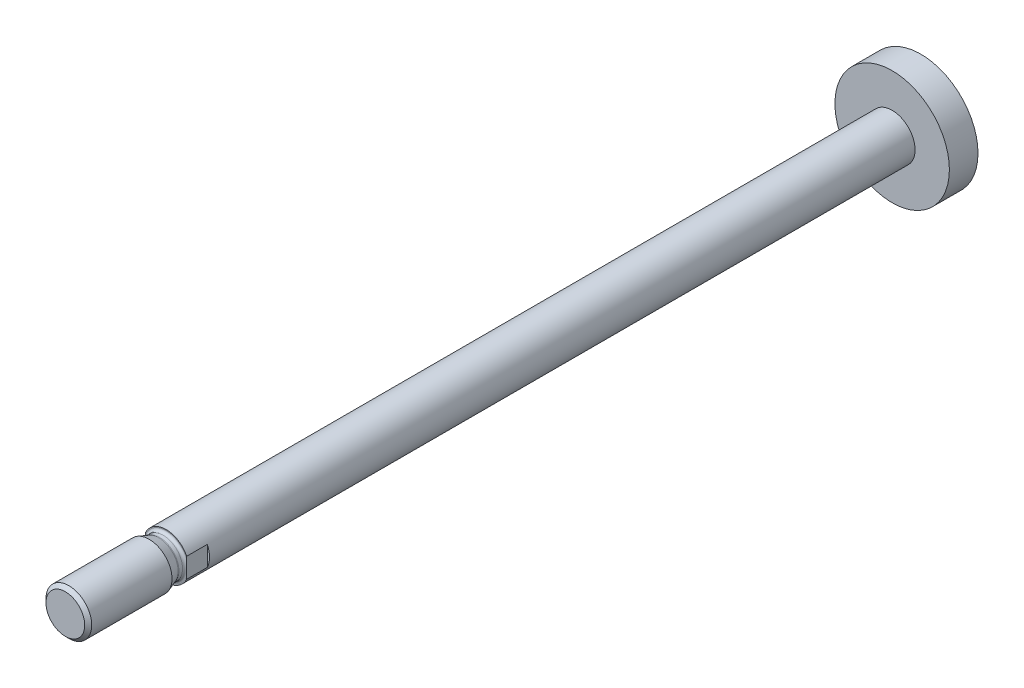
ISO-10303-21;
HEADER;
FILE_DESCRIPTION(('STEP AP214'),'2;1');
FILE_NAME('part.step','',(''),(''),'','','');
FILE_SCHEMA(('AUTOMOTIVE_DESIGN { 1 0 10303 214 1 1 1 1 }'));
ENDSEC;
DATA;
#1=APPLICATION_CONTEXT('core data for automotive mechanical design processes');
#2=APPLICATION_PROTOCOL_DEFINITION('international standard','automotive_design',2000,#1);
#3=PRODUCT_CONTEXT('',#1,'mechanical');
#4=PRODUCT('Part','Part','',(#3));
#5=PRODUCT_RELATED_PRODUCT_CATEGORY('part','',(#4));
#6=PRODUCT_DEFINITION_FORMATION('','',#4);
#7=PRODUCT_DEFINITION_CONTEXT('part definition',#1,'design');
#8=PRODUCT_DEFINITION('design','',#6,#7);
#9=PRODUCT_DEFINITION_SHAPE('','',#8);
#10=(LENGTH_UNIT() NAMED_UNIT(*) SI_UNIT(.MILLI.,.METRE.));
#11=(NAMED_UNIT(*) PLANE_ANGLE_UNIT() SI_UNIT($,.RADIAN.));
#12=(NAMED_UNIT(*) SI_UNIT($,.STERADIAN.) SOLID_ANGLE_UNIT());
#13=UNCERTAINTY_MEASURE_WITH_UNIT(LENGTH_MEASURE(1.E-05),#10,'distance_accuracy_value','');
#14=(GEOMETRIC_REPRESENTATION_CONTEXT(3) GLOBAL_UNCERTAINTY_ASSIGNED_CONTEXT((#13)) GLOBAL_UNIT_ASSIGNED_CONTEXT((#10,
#11,#12)) REPRESENTATION_CONTEXT('',''));
#15=CARTESIAN_POINT('',(0.,0.,0.));
#16=DIRECTION('',(0.,0.,1.));
#17=DIRECTION('',(1.,0.,0.));
#18=AXIS2_PLACEMENT_3D('',#15,#16,#17);
#19=CARTESIAN_POINT('',(0.,0.,6.));
#20=DIRECTION('',(0.,0.,-1.));
#21=DIRECTION('',(-1.,0.,0.));
#22=AXIS2_PLACEMENT_3D('',#19,#20,#21);
#23=PLANE('',#22);
#24=DIRECTION('',(0.,1.,0.));
#25=VECTOR('',#24,1.);
#26=CARTESIAN_POINT('',(-4.5,0.,6.));
#27=LINE('',#26,#25);
#28=CARTESIAN_POINT('',(-4.5,-2.17944947177034,6.00000000000001));
#29=VERTEX_POINT('',#28);
#30=CARTESIAN_POINT('',(-4.5,-1.67032930884929,6.));
#31=VERTEX_POINT('',#30);
#32=EDGE_CURVE('E52',#29,#31,#27,.T.);
#33=ORIENTED_EDGE('',*,*,#32,.F.);
#34=CARTESIAN_POINT('',(0.,0.,6.00000000000001));
#35=DIRECTION('',(0.,0.,1.));
#36=DIRECTION('',(1.,0.,0.));
#37=AXIS2_PLACEMENT_3D('',#34,#35,#36);
#38=CIRCLE('',#37,5.);
#39=CARTESIAN_POINT('',(4.5,-2.17944947177034,6.00000000000001));
#40=VERTEX_POINT('',#39);
#41=EDGE_CURVE('E145',#29,#40,#38,.T.);
#42=ORIENTED_EDGE('',*,*,#41,.T.);
#43=DIRECTION('',(0.,-1.,0.));
#44=VECTOR('',#43,1.);
#45=CARTESIAN_POINT('',(4.5,0.,6.));
#46=LINE('',#45,#44);
#47=CARTESIAN_POINT('',(4.5,-1.67032930884926,5.99999999999964));
#48=VERTEX_POINT('',#47);
#49=EDGE_CURVE('E99',#48,#40,#46,.T.);
#50=ORIENTED_EDGE('',*,*,#49,.F.);
#51=CARTESIAN_POINT('',(0.,0.,6.));
#52=DIRECTION('',(0.,0.,1.));
#53=DIRECTION('',(1.,0.,0.));
#54=AXIS2_PLACEMENT_3D('',#51,#52,#53);
#55=CIRCLE('',#54,4.8000000000001);
#56=EDGE_CURVE('E147',#31,#48,#55,.T.);
#57=ORIENTED_EDGE('',*,*,#56,.F.);
#58=EDGE_LOOP('',(#33,#42,#50,#57));
#59=FACE_BOUND('',#58,.T.);
#60=ADVANCED_FACE('F38',(#59),#23,.F.);
#61=CARTESIAN_POINT('',(-4.5,1.67032930884926,5.99999999999964));
#62=VERTEX_POINT('',#61);
#63=CARTESIAN_POINT('',(-4.5,2.17944947177034,6.00000000000001));
#64=VERTEX_POINT('',#63);
#65=EDGE_CURVE('E108',#62,#64,#27,.T.);
#66=ORIENTED_EDGE('',*,*,#65,.F.);
#67=CARTESIAN_POINT('',(4.5,1.67032930884929,6.));
#68=VERTEX_POINT('',#67);
#69=EDGE_CURVE('E148',#68,#62,#55,.T.);
#70=ORIENTED_EDGE('',*,*,#69,.F.);
#71=CARTESIAN_POINT('',(4.5,2.17944947177034,6.00000000000001));
#72=VERTEX_POINT('',#71);
#73=EDGE_CURVE('E60',#72,#68,#46,.T.);
#74=ORIENTED_EDGE('',*,*,#73,.F.);
#75=EDGE_CURVE('E107',#72,#64,#38,.T.);
#76=ORIENTED_EDGE('',*,*,#75,.T.);
#77=EDGE_LOOP('',(#66,#70,#74,#76));
#78=FACE_BOUND('',#77,.T.);
#79=ADVANCED_FACE('F204',(#78),#23,.F.);
#80=CARTESIAN_POINT('',(0.,0.,-158.85));
#81=DIRECTION('',(0.,0.,1.));
#82=DIRECTION('',(1.,0.,0.));
#83=AXIS2_PLACEMENT_3D('',#80,#81,#82);
#84=CYLINDRICAL_SURFACE('',#83,5.);
#85=CARTESIAN_POINT('',(0.,0.,-152.6));
#86=DIRECTION('',(0.,0.,1.));
#87=DIRECTION('',(1.,0.,0.));
#88=AXIS2_PLACEMENT_3D('',#85,#86,#87);
#89=CIRCLE('',#88,5.);
#90=CARTESIAN_POINT('',(5.,0.,-152.6));
#91=VERTEX_POINT('',#90);
#92=EDGE_CURVE('E142',#91,#91,#89,.T.);
#93=ORIENTED_EDGE('',*,*,#92,.T.);
#94=EDGE_LOOP('',(#93));
#95=FACE_BOUND('',#94,.T.);
#96=DIRECTION('',(0.,0.,1.));
#97=VECTOR('',#96,1.);
#98=CARTESIAN_POINT('',(-4.5,-2.17944947177034,-158.85));
#99=LINE('',#98,#97);
#100=CARTESIAN_POINT('',(-4.5,-2.17944947177034,1.5));
#101=VERTEX_POINT('',#100);
#102=EDGE_CURVE('E116',#101,#29,#99,.T.);
#103=ORIENTED_EDGE('',*,*,#102,.F.);
#104=CARTESIAN_POINT('',(0.,0.,1.5));
#105=DIRECTION('',(0.,0.,1.));
#106=DIRECTION('',(1.,0.,0.));
#107=AXIS2_PLACEMENT_3D('',#104,#105,#106);
#108=CIRCLE('',#107,5.);
#109=CARTESIAN_POINT('',(-4.5,2.17944947177034,1.5));
#110=VERTEX_POINT('',#109);
#111=EDGE_CURVE('E11',#110,#101,#108,.T.);
#112=ORIENTED_EDGE('',*,*,#111,.F.);
#113=DIRECTION('',(0.,0.,1.));
#114=VECTOR('',#113,1.);
#115=CARTESIAN_POINT('',(-4.5,2.17944947177034,-158.85));
#116=LINE('',#115,#114);
#117=EDGE_CURVE('E114',#64,#110,#116,.F.);
#118=ORIENTED_EDGE('',*,*,#117,.F.);
#119=ORIENTED_EDGE('',*,*,#75,.F.);
#120=DIRECTION('',(0.,0.,1.));
#121=VECTOR('',#120,1.);
#122=CARTESIAN_POINT('',(4.5,2.17944947177034,-158.85));
#123=LINE('',#122,#121);
#124=CARTESIAN_POINT('',(4.5,2.17944947177034,1.5));
#125=VERTEX_POINT('',#124);
#126=EDGE_CURVE('E97',#125,#72,#123,.T.);
#127=ORIENTED_EDGE('',*,*,#126,.F.);
#128=CARTESIAN_POINT('',(4.5,-2.17944947177034,1.5));
#129=VERTEX_POINT('',#128);
#130=EDGE_CURVE('E41',#129,#125,#108,.T.);
#131=ORIENTED_EDGE('',*,*,#130,.F.);
#132=DIRECTION('',(0.,0.,1.));
#133=VECTOR('',#132,1.);
#134=CARTESIAN_POINT('',(4.5,-2.17944947177034,-158.85));
#135=LINE('',#134,#133);
#136=EDGE_CURVE('E98',#40,#129,#135,.F.);
#137=ORIENTED_EDGE('',*,*,#136,.F.);
#138=ORIENTED_EDGE('',*,*,#41,.F.);
#139=EDGE_LOOP('',(#103,#112,#118,#119,#127,#131,#137,#138));
#140=FACE_BOUND('',#139,.T.);
#141=ADVANCED_FACE('F104',(#95,#140),#84,.T.);
#142=CARTESIAN_POINT('',(0.,0.,6.6000000000001));
#143=DIRECTION('',(0.,0.,1.));
#144=DIRECTION('',(1.,0.,0.));
#145=AXIS2_PLACEMENT_3D('',#142,#143,#144);
#146=TOROIDAL_SURFACE('',#145,4.8000000000001,0.600000000000097);
#147=CARTESIAN_POINT('',(0.,0.,6.6));
#148=DIRECTION('',(0.,0.,1.));
#149=DIRECTION('',(1.,0.,0.));
#150=AXIS2_PLACEMENT_3D('',#147,#148,#149);
#151=CIRCLE('',#150,4.2);
#152=CARTESIAN_POINT('',(4.2,0.,6.6));
#153=VERTEX_POINT('',#152);
#154=EDGE_CURVE('E133',#153,#153,#151,.T.);
#155=ORIENTED_EDGE('',*,*,#154,.F.);
#156=EDGE_LOOP('',(#155));
#157=FACE_BOUND('',#156,.T.);
#158=CARTESIAN_POINT('',(-4.5,0.,6.08038475772938));
#159=CARTESIAN_POINT('',(-4.5,0.0998067376764843,6.08037873066074));
#160=CARTESIAN_POINT('',(-4.5,0.199616272799417,6.07841991767971));
#161=CARTESIAN_POINT('',(-4.5,0.399124218962602,6.07111486101505));
#162=CARTESIAN_POINT('',(-4.5,0.498822593852194,6.0657677261318));
#163=CARTESIAN_POINT('',(-4.5,0.698741622507767,6.05307617315213));
#164=CARTESIAN_POINT('',(-4.5,0.798961381101574,6.0457188074819));
#165=CARTESIAN_POINT('',(-4.5,0.999428388252497,6.03096110271823));
#166=CARTESIAN_POINT('',(-4.5,1.09967563538733,6.0235607506722));
#167=CARTESIAN_POINT('',(-4.5,1.3016110629467,6.01081416538467));
#168=CARTESIAN_POINT('',(-4.5,1.40330123417861,6.00549549428931));
#169=CARTESIAN_POINT('',(-4.5,1.60677834274211,5.99955448543189));
#170=CARTESIAN_POINT('',(-4.5,1.70856516640856,5.99892893983888));
#171=CARTESIAN_POINT('',(-4.5,1.91089156421157,6.00529022688693));
#172=CARTESIAN_POINT('',(-4.5,2.01143241584337,6.01219244591137));
#173=CARTESIAN_POINT('',(-4.5,2.16105475707008,6.03106064313289));
#174=CARTESIAN_POINT('',(-4.5,2.21066681684127,6.03875363847474));
#175=CARTESIAN_POINT('',(-4.5,2.30920875497539,6.05763368849147));
#176=CARTESIAN_POINT('',(-4.5,2.35813908405672,6.06881830784301));
#177=CARTESIAN_POINT('',(-4.5,2.45129258214881,6.09452632536258));
#178=CARTESIAN_POINT('',(-4.5,2.49559809321058,6.10874531075254));
#179=CARTESIAN_POINT('',(-4.5,2.58269752158666,6.14182358984602));
#180=CARTESIAN_POINT('',(-4.5,2.62548470760037,6.16070115913153));
#181=CARTESIAN_POINT('',(-4.5,2.708771704774,6.20450151168286));
#182=CARTESIAN_POINT('',(-4.5,2.7492254368668,6.22951398112986));
#183=CARTESIAN_POINT('',(-4.5,2.8245886025167,6.28679682914211));
#184=CARTESIAN_POINT('',(-4.5,2.85953391357846,6.31901662605556));
#185=CARTESIAN_POINT('',(-4.5,2.90361083640121,6.37234972904509));
#186=CARTESIAN_POINT('',(-4.5,2.91659554231069,6.39027429027149));
#187=CARTESIAN_POINT('',(-4.5,2.93974058832693,6.42788720022357));
#188=CARTESIAN_POINT('',(-4.5,2.94990211335329,6.44757480437922));
#189=CARTESIAN_POINT('',(-4.5,2.96675958241278,6.48864437298186));
#190=CARTESIAN_POINT('',(-4.5,2.97341943638567,6.51004146018642));
#191=CARTESIAN_POINT('',(-4.5,2.98245791270468,6.55372202128066));
#192=CARTESIAN_POINT('',(-4.5,2.98484130218967,6.57600447984377));
#193=CARTESIAN_POINT('',(-4.5,2.98506053282126,6.61790531869471));
#194=CARTESIAN_POINT('',(-4.5,2.98340761486304,6.63752261821441));
#195=CARTESIAN_POINT('',(-4.5,2.97674509421289,6.67617607456343));
#196=CARTESIAN_POINT('',(-4.5,2.97173449743984,6.6952120575414));
#197=CARTESIAN_POINT('',(-4.5,2.95888564781516,6.73184320253794));
#198=CARTESIAN_POINT('',(-4.5,2.95110802141781,6.74946002141396));
#199=CARTESIAN_POINT('',(-4.5,2.93318626166465,6.7834289561956));
#200=CARTESIAN_POINT('',(-4.5,2.9230415253375,6.79978074844682));
#201=CARTESIAN_POINT('',(-4.5,2.89384468501091,6.84100748772974));
#202=CARTESIAN_POINT('',(-4.5,2.87320788143216,6.86476044928355));
#203=CARTESIAN_POINT('',(-4.5,2.82847619421112,6.90876991000349));
#204=CARTESIAN_POINT('',(-4.5,2.80437017771157,6.92901467162748));
#205=CARTESIAN_POINT('',(-4.5,2.73725469332988,6.9786229862522));
#206=CARTESIAN_POINT('',(-4.5,2.69223076475127,7.00523927036113));
#207=CARTESIAN_POINT('',(-4.5,2.59889783314091,7.05161749488126));
#208=CARTESIAN_POINT('',(-4.5,2.55058470947157,7.07137064103301));
#209=CARTESIAN_POINT('',(-4.5,2.45254575507272,7.10534880858189));
#210=CARTESIAN_POINT('',(-4.5,2.40283511990763,7.11961868503931));
#211=CARTESIAN_POINT('',(-4.5,2.30236556499697,7.14394174846778));
#212=CARTESIAN_POINT('',(-4.5,2.25160550461614,7.15399006350479));
#213=CARTESIAN_POINT('',(-4.5,2.14932910845115,7.17070819486747));
#214=CARTESIAN_POINT('',(-4.5,2.097810491898,7.17736364613804));
#215=CARTESIAN_POINT('',(-4.5,1.99454893701165,7.18787736691893));
#216=CARTESIAN_POINT('',(-4.5,1.94280625316185,7.19173824340202));
#217=CARTESIAN_POINT('',(-4.5,1.76963465418981,7.20091417499184));
#218=CARTESIAN_POINT('',(-4.5,1.64795335250754,7.20121716445481));
#219=CARTESIAN_POINT('',(-4.5,1.40473993568908,7.19490670898454));
#220=CARTESIAN_POINT('',(-4.5,1.28320824117427,7.18828396320795));
#221=CARTESIAN_POINT('',(-4.5,1.04004923255828,7.17231563103041));
#222=CARTESIAN_POINT('',(-4.5,0.918422381035732,7.16296359204275));
#223=CARTESIAN_POINT('',(-4.5,0.675162216086409,7.14536648513597));
#224=CARTESIAN_POINT('',(-4.5,0.553528961243309,7.13712068197018));
#225=CARTESIAN_POINT('',(-4.5,0.309531254649917,7.12487742633612));
#226=CARTESIAN_POINT('',(-4.5,0.187165819913507,7.12089702125178));
#227=CARTESIAN_POINT('',(-4.5,-0.0576260136229764,7.1188711150715));
#228=CARTESIAN_POINT('',(-4.5,-0.180052414605451,7.12082584439527));
#229=CARTESIAN_POINT('',(-4.5,-0.424689664494776,7.12986037925898));
#230=CARTESIAN_POINT('',(-4.5,-0.546900510702155,7.13694024853251));
#231=CARTESIAN_POINT('',(-4.5,-0.791163807552297,7.15343708959476));
#232=CARTESIAN_POINT('',(-4.5,-0.913216226261198,7.16285447562868));
#233=CARTESIAN_POINT('',(-4.5,-1.13754216677607,7.17890571514816));
#234=CARTESIAN_POINT('',(-4.5,-1.23979919195089,7.18574310750968));
#235=CARTESIAN_POINT('',(-4.5,-1.44455801915984,7.19605628308861));
#236=CARTESIAN_POINT('',(-4.5,-1.54705992400007,7.1995302378615));
#237=CARTESIAN_POINT('',(-4.5,-1.75146483914747,7.20038116690825));
#238=CARTESIAN_POINT('',(-4.5,-1.85336706889882,7.19780028707852));
#239=CARTESIAN_POINT('',(-4.5,-2.00565175722784,7.18686770203603));
#240=CARTESIAN_POINT('',(-4.5,-2.05628276458105,7.18205255328381));
#241=CARTESIAN_POINT('',(-4.5,-2.15717659421825,7.16951871362447));
#242=CARTESIAN_POINT('',(-4.5,-2.20743958707826,7.16180146783043));
#243=CARTESIAN_POINT('',(-4.5,-2.28957213203389,7.14616674992979));
#244=CARTESIAN_POINT('',(-4.5,-2.32164005179182,7.13929190900874));
#245=CARTESIAN_POINT('',(-4.5,-2.38537373262414,7.12382910737058));
#246=CARTESIAN_POINT('',(-4.5,-2.41703940005995,7.11524075527335));
#247=CARTESIAN_POINT('',(-4.5,-2.47977482389712,7.09609145753328));
#248=CARTESIAN_POINT('',(-4.5,-2.51084460251956,7.08553058560536));
#249=CARTESIAN_POINT('',(-4.5,-2.57210334525408,7.06212827888268));
#250=CARTESIAN_POINT('',(-4.5,-2.6022927946332,7.0492881292692));
#251=CARTESIAN_POINT('',(-4.5,-2.66558221016024,7.01895384344607));
#252=CARTESIAN_POINT('',(-4.5,-2.69849376976795,7.00105903073458));
#253=CARTESIAN_POINT('',(-4.5,-2.76174921773302,6.96115946169793));
#254=CARTESIAN_POINT('',(-4.5,-2.79209631989084,6.93915996380233));
#255=CARTESIAN_POINT('',(-4.5,-2.84141302820097,6.89665559850046));
#256=CARTESIAN_POINT('',(-4.5,-2.86129984579273,6.87722524149457));
#257=CARTESIAN_POINT('',(-4.5,-2.89785672391277,6.8355233653846));
#258=CARTESIAN_POINT('',(-4.5,-2.91453205990263,6.81325660734041));
#259=CARTESIAN_POINT('',(-4.5,-2.93987201752797,6.77175640031647));
#260=CARTESIAN_POINT('',(-4.5,-2.94949836759846,6.7531143094616));
#261=CARTESIAN_POINT('',(-4.5,-2.96557855433331,6.71450034894554));
#262=CARTESIAN_POINT('',(-4.5,-2.97203515487244,6.69452965508271));
#263=CARTESIAN_POINT('',(-4.5,-2.98127259888945,6.65358938291631));
#264=CARTESIAN_POINT('',(-4.5,-2.98402709496137,6.63261373368397));
#265=CARTESIAN_POINT('',(-4.5,-2.98549402202548,6.5905217722223));
#266=CARTESIAN_POINT('',(-4.5,-2.98420752398454,6.56940549874219));
#267=CARTESIAN_POINT('',(-4.5,-2.97807496487522,6.52999280261072));
#268=CARTESIAN_POINT('',(-4.5,-2.97361805206967,6.5116336149263));
#269=CARTESIAN_POINT('',(-4.5,-2.96191834816582,6.47583441641286));
#270=CARTESIAN_POINT('',(-4.5,-2.95467452714891,6.45839474811012));
#271=CARTESIAN_POINT('',(-4.5,-2.93457216876764,6.41818105233859));
#272=CARTESIAN_POINT('',(-4.5,-2.92062563899873,6.39595214139084));
#273=CARTESIAN_POINT('',(-4.5,-2.88935514164919,6.35401611982453));
#274=CARTESIAN_POINT('',(-4.5,-2.8720236529583,6.33431478984219));
#275=CARTESIAN_POINT('',(-4.5,-2.82503290035833,6.28751283069156));
#276=CARTESIAN_POINT('',(-4.5,-2.79373056698905,6.26207403715508));
#277=CARTESIAN_POINT('',(-4.5,-2.72769125075381,6.21619293089448));
#278=CARTESIAN_POINT('',(-4.5,-2.69294681030937,6.19576181546384));
#279=CARTESIAN_POINT('',(-4.5,-2.62462940824694,6.16075352289615));
#280=CARTESIAN_POINT('',(-4.5,-2.59123929314754,6.14581211330114));
#281=CARTESIAN_POINT('',(-4.5,-2.52328983133287,6.11882957544506));
#282=CARTESIAN_POINT('',(-4.5,-2.48872943653316,6.10679112981438));
#283=CARTESIAN_POINT('',(-4.5,-2.41880662026664,6.08517054590459));
#284=CARTESIAN_POINT('',(-4.5,-2.38344313889604,6.07559188702146));
#285=CARTESIAN_POINT('',(-4.5,-2.31224293996831,6.05855773562935));
#286=CARTESIAN_POINT('',(-4.5,-2.27640656151919,6.05110079993009));
#287=CARTESIAN_POINT('',(-4.5,-2.16480723915517,6.0307785973574));
#288=CARTESIAN_POINT('',(-4.5,-2.08848391630038,6.02098616115935));
#289=CARTESIAN_POINT('',(-4.5,-1.93529360231886,6.00719570952082));
#290=CARTESIAN_POINT('',(-4.5,-1.85842605923994,6.0032048149566));
#291=CARTESIAN_POINT('',(-4.5,-1.70429930814401,5.99943251502908));
#292=CARTESIAN_POINT('',(-4.5,-1.62703976289022,5.99966800277574));
#293=CARTESIAN_POINT('',(-4.5,-1.47257781131278,6.00308214682154));
#294=CARTESIAN_POINT('',(-4.5,-1.39537543023679,6.0062617185583));
#295=CARTESIAN_POINT('',(-4.5,-1.16283780279443,6.01854464880536));
#296=CARTESIAN_POINT('',(-4.5,-1.00766573353247,6.0303854324212));
#297=CARTESIAN_POINT('',(-4.5,-0.775047905736102,6.04745755016681));
#298=CARTESIAN_POINT('',(-4.5,-0.697616588951308,6.05302769829481));
#299=CARTESIAN_POINT('',(-4.5,-0.542684692223429,6.06307257652476));
#300=CARTESIAN_POINT('',(-4.5,-0.465184120366961,6.0675474210761));
#301=CARTESIAN_POINT('',(-4.5,-0.322984015763616,6.07408605688258));
#302=CARTESIAN_POINT('',(-4.5,-0.258297640774171,6.07642695447791));
#303=CARTESIAN_POINT('',(-4.5,-0.129074493107146,6.07957603824672));
#304=CARTESIAN_POINT('',(-4.5,-0.0645378313986,6.08038865500073));
#305=CARTESIAN_POINT('',(-4.5,0.,6.08038475772938));
#306=B_SPLINE_CURVE_WITH_KNOTS('',3,(#158,#159,#160,#161,#162,#163,#164,#165,#166,#167,#168,
#169,#170,#171,#172,#173,#174,#175,#176,#177,#178,#179,#180,#181,#182,#183,#184,#185,#186,#187,
#188,#189,#190,#191,#192,#193,#194,#195,#196,#197,#198,#199,#200,#201,#202,#203,#204,#205,#206,
#207,#208,#209,#210,#211,#212,#213,#214,#215,#216,#217,#218,#219,#220,#221,#222,#223,#224,#225,
#226,#227,#228,#229,#230,#231,#232,#233,#234,#235,#236,#237,#238,#239,#240,#241,#242,#243,#244,
#245,#246,#247,#248,#249,#250,#251,#252,#253,#254,#255,#256,#257,#258,#259,#260,#261,#262,#263,
#264,#265,#266,#267,#268,#269,#270,#271,#272,#273,#274,#275,#276,#277,#278,#279,#280,#281,#282,
#283,#284,#285,#286,#287,#288,#289,#290,#291,#292,#293,#294,#295,#296,#297,#298,#299,#300,#301,
#302,#303,#304,#305),.UNSPECIFIED.,.T.,.F.,(4,2,2,2,2,2,2,2,2,2,2,2,2,2,2,2,2,2,2,2,2,2,2,2,2,2,
2,2,2,2,2,2,2,2,2,2,2,2,2,2,2,2,2,2,2,2,2,2,2,2,2,2,2,2,2,2,2,2,2,2,2,2,2,2,2,2,2,2,2,2,2,2,2,
4),(0.,0.2994098141348,0.598898412026793,0.900363389970373,1.20192447826241,1.50735320280908,
1.81257314260134,2.11439737680963,2.26491759901501,2.41533307068,2.55473558197034,
2.69469391263366,2.83683494912431,2.97800809289031,3.04420873642002,3.11038155270318,
3.17722363582535,3.24399116111409,3.30274900336453,3.36152424926965,3.4190838743025,
3.47665817747352,3.57051166174347,3.66467333495767,3.82069752394767,3.97692090756113,
4.13183764823947,4.28693268422187,4.44267903462694,4.598279906144,4.96287650737647,
5.32796336933296,5.69392045928577,6.05963310224143,6.42680198779118,6.79398512811941,
7.16117283462598,7.52842565915926,7.83585950589185,8.1434603872773,8.44892650990403,
8.6014429535017,8.75388355115798,8.85223498802891,8.95060891495163,9.04897916628346,
9.14729412626638,9.25944677261991,9.37145671687506,9.45461643081231,9.53763835181273,
9.60034145289489,9.66298978223713,9.72608165177017,9.78915680175371,9.8455891262504,
9.90204232571399,9.98032625055131,10.0587861366062,10.1791154564982,10.2997114301861,
10.4092927110068,10.5189748711755,10.6288113338668,10.7385729065131,10.9690632532295,
11.199836268168,11.4315319017406,11.6632996032826,12.1301114361985,12.36300865042,
12.5958815185765,12.7900520739374,12.9836588439167),.UNSPECIFIED.);
#307=EDGE_CURVE('E95',#31,#62,#306,.T.);
#308=ORIENTED_EDGE('',*,*,#307,.F.);
#309=ORIENTED_EDGE('',*,*,#56,.T.);
#310=CARTESIAN_POINT('',(4.5,0.,6.08038475772938));
#311=CARTESIAN_POINT('',(4.5,-0.0998067376764843,6.08037873066074));
#312=CARTESIAN_POINT('',(4.5,-0.199616272799417,6.07841991767971));
#313=CARTESIAN_POINT('',(4.5,-0.399124218962602,6.07111486101505));
#314=CARTESIAN_POINT('',(4.5,-0.498822593852194,6.0657677261318));
#315=CARTESIAN_POINT('',(4.5,-0.698741622507767,6.05307617315213));
#316=CARTESIAN_POINT('',(4.5,-0.798961381101574,6.0457188074819));
#317=CARTESIAN_POINT('',(4.5,-0.999428388252497,6.03096110271823));
#318=CARTESIAN_POINT('',(4.5,-1.09967563538733,6.0235607506722));
#319=CARTESIAN_POINT('',(4.5,-1.3016110629467,6.01081416538467));
#320=CARTESIAN_POINT('',(4.5,-1.40330123417861,6.00549549428931));
#321=CARTESIAN_POINT('',(4.5,-1.60677834274211,5.99955448543189));
#322=CARTESIAN_POINT('',(4.5,-1.70856516640856,5.99892893983888));
#323=CARTESIAN_POINT('',(4.5,-1.91089156421157,6.00529022688693));
#324=CARTESIAN_POINT('',(4.5,-2.01143241584337,6.01219244591137));
#325=CARTESIAN_POINT('',(4.5,-2.16105475707008,6.03106064313289));
#326=CARTESIAN_POINT('',(4.5,-2.21066681684127,6.03875363847474));
#327=CARTESIAN_POINT('',(4.5,-2.30920875497539,6.05763368849147));
#328=CARTESIAN_POINT('',(4.5,-2.35813908405672,6.06881830784301));
#329=CARTESIAN_POINT('',(4.5,-2.45129258214881,6.09452632536258));
#330=CARTESIAN_POINT('',(4.5,-2.49559809321058,6.10874531075254));
#331=CARTESIAN_POINT('',(4.5,-2.58269752158666,6.14182358984602));
#332=CARTESIAN_POINT('',(4.5,-2.62548470760037,6.16070115913153));
#333=CARTESIAN_POINT('',(4.5,-2.708771704774,6.20450151168286));
#334=CARTESIAN_POINT('',(4.5,-2.7492254368668,6.22951398112986));
#335=CARTESIAN_POINT('',(4.5,-2.8245886025167,6.28679682914211));
#336=CARTESIAN_POINT('',(4.5,-2.85953391357846,6.31901662605556));
#337=CARTESIAN_POINT('',(4.5,-2.90361083640121,6.37234972904509));
#338=CARTESIAN_POINT('',(4.5,-2.91659554231069,6.39027429027149));
#339=CARTESIAN_POINT('',(4.5,-2.93974058832693,6.42788720022357));
#340=CARTESIAN_POINT('',(4.5,-2.94990211335329,6.44757480437922));
#341=CARTESIAN_POINT('',(4.5,-2.96675958241278,6.48864437298186));
#342=CARTESIAN_POINT('',(4.5,-2.97341943638567,6.51004146018642));
#343=CARTESIAN_POINT('',(4.5,-2.98245791270468,6.55372202128066));
#344=CARTESIAN_POINT('',(4.5,-2.98484130218967,6.57600447984377));
#345=CARTESIAN_POINT('',(4.5,-2.98506053282126,6.61790531869471));
#346=CARTESIAN_POINT('',(4.5,-2.98340761486304,6.63752261821441));
#347=CARTESIAN_POINT('',(4.5,-2.97674509421289,6.67617607456343));
#348=CARTESIAN_POINT('',(4.5,-2.97173449743984,6.6952120575414));
#349=CARTESIAN_POINT('',(4.5,-2.95888564781516,6.73184320253794));
#350=CARTESIAN_POINT('',(4.5,-2.95110802141781,6.74946002141396));
#351=CARTESIAN_POINT('',(4.5,-2.93318626166465,6.7834289561956));
#352=CARTESIAN_POINT('',(4.5,-2.9230415253375,6.79978074844682));
#353=CARTESIAN_POINT('',(4.5,-2.89384468501091,6.84100748772974));
#354=CARTESIAN_POINT('',(4.5,-2.87320788143216,6.86476044928355));
#355=CARTESIAN_POINT('',(4.5,-2.82847619421112,6.90876991000349));
#356=CARTESIAN_POINT('',(4.5,-2.80437017771157,6.92901467162748));
#357=CARTESIAN_POINT('',(4.5,-2.73725469332988,6.9786229862522));
#358=CARTESIAN_POINT('',(4.5,-2.69223076475127,7.00523927036113));
#359=CARTESIAN_POINT('',(4.5,-2.59889783314091,7.05161749488126));
#360=CARTESIAN_POINT('',(4.5,-2.55058470947157,7.07137064103301));
#361=CARTESIAN_POINT('',(4.5,-2.45254575507272,7.10534880858189));
#362=CARTESIAN_POINT('',(4.5,-2.40283511990763,7.11961868503931));
#363=CARTESIAN_POINT('',(4.5,-2.30236556499697,7.14394174846778));
#364=CARTESIAN_POINT('',(4.5,-2.25160550461614,7.15399006350479));
#365=CARTESIAN_POINT('',(4.5,-2.14932910845115,7.17070819486747));
#366=CARTESIAN_POINT('',(4.5,-2.097810491898,7.17736364613804));
#367=CARTESIAN_POINT('',(4.5,-1.99454893701165,7.18787736691893));
#368=CARTESIAN_POINT('',(4.5,-1.94280625316185,7.19173824340202));
#369=CARTESIAN_POINT('',(4.5,-1.76963465418981,7.20091417499184));
#370=CARTESIAN_POINT('',(4.5,-1.64795335250754,7.20121716445481));
#371=CARTESIAN_POINT('',(4.5,-1.40473993568908,7.19490670898454));
#372=CARTESIAN_POINT('',(4.5,-1.28320824117427,7.18828396320795));
#373=CARTESIAN_POINT('',(4.5,-1.04004923255828,7.17231563103041));
#374=CARTESIAN_POINT('',(4.5,-0.918422381035732,7.16296359204275));
#375=CARTESIAN_POINT('',(4.5,-0.675162216086409,7.14536648513597));
#376=CARTESIAN_POINT('',(4.5,-0.553528961243309,7.13712068197018));
#377=CARTESIAN_POINT('',(4.5,-0.309531254649917,7.12487742633612));
#378=CARTESIAN_POINT('',(4.5,-0.187165819913507,7.12089702125178));
#379=CARTESIAN_POINT('',(4.5,0.0576260136229764,7.1188711150715));
#380=CARTESIAN_POINT('',(4.5,0.180052414605451,7.12082584439527));
#381=CARTESIAN_POINT('',(4.5,0.424689664494776,7.12986037925898));
#382=CARTESIAN_POINT('',(4.5,0.546900510702155,7.13694024853251));
#383=CARTESIAN_POINT('',(4.5,0.791163807552297,7.15343708959476));
#384=CARTESIAN_POINT('',(4.5,0.913216226261198,7.16285447562868));
#385=CARTESIAN_POINT('',(4.5,1.13754216677607,7.17890571514816));
#386=CARTESIAN_POINT('',(4.5,1.23979919195089,7.18574310750968));
#387=CARTESIAN_POINT('',(4.5,1.44455801915984,7.19605628308861));
#388=CARTESIAN_POINT('',(4.5,1.54705992400007,7.1995302378615));
#389=CARTESIAN_POINT('',(4.5,1.75146483914747,7.20038116690825));
#390=CARTESIAN_POINT('',(4.5,1.85336706889882,7.19780028707852));
#391=CARTESIAN_POINT('',(4.5,2.00565175722784,7.18686770203603));
#392=CARTESIAN_POINT('',(4.5,2.05628276458105,7.18205255328381));
#393=CARTESIAN_POINT('',(4.5,2.15717659421825,7.16951871362447));
#394=CARTESIAN_POINT('',(4.5,2.20743958707826,7.16180146783043));
#395=CARTESIAN_POINT('',(4.5,2.28957213203389,7.14616674992979));
#396=CARTESIAN_POINT('',(4.5,2.32164005179182,7.13929190900874));
#397=CARTESIAN_POINT('',(4.5,2.38537373262414,7.12382910737058));
#398=CARTESIAN_POINT('',(4.5,2.41703940005995,7.11524075527335));
#399=CARTESIAN_POINT('',(4.5,2.47977482389712,7.09609145753328));
#400=CARTESIAN_POINT('',(4.5,2.51084460251956,7.08553058560536));
#401=CARTESIAN_POINT('',(4.5,2.57210334525408,7.06212827888268));
#402=CARTESIAN_POINT('',(4.5,2.6022927946332,7.0492881292692));
#403=CARTESIAN_POINT('',(4.5,2.66558221016024,7.01895384344607));
#404=CARTESIAN_POINT('',(4.5,2.69849376976795,7.00105903073458));
#405=CARTESIAN_POINT('',(4.5,2.76174921773302,6.96115946169793));
#406=CARTESIAN_POINT('',(4.5,2.79209631989084,6.93915996380233));
#407=CARTESIAN_POINT('',(4.5,2.84141302820097,6.89665559850046));
#408=CARTESIAN_POINT('',(4.5,2.86129984579273,6.87722524149457));
#409=CARTESIAN_POINT('',(4.5,2.89785672391277,6.8355233653846));
#410=CARTESIAN_POINT('',(4.5,2.91453205990263,6.81325660734041));
#411=CARTESIAN_POINT('',(4.5,2.93987201752797,6.77175640031647));
#412=CARTESIAN_POINT('',(4.5,2.94949836759846,6.7531143094616));
#413=CARTESIAN_POINT('',(4.5,2.96557855433331,6.71450034894554));
#414=CARTESIAN_POINT('',(4.5,2.97203515487244,6.69452965508271));
#415=CARTESIAN_POINT('',(4.5,2.98127259888945,6.65358938291631));
#416=CARTESIAN_POINT('',(4.5,2.98402709496137,6.63261373368397));
#417=CARTESIAN_POINT('',(4.5,2.98549402202548,6.5905217722223));
#418=CARTESIAN_POINT('',(4.5,2.98420752398454,6.56940549874219));
#419=CARTESIAN_POINT('',(4.5,2.97807496487522,6.52999280261072));
#420=CARTESIAN_POINT('',(4.5,2.97361805206967,6.5116336149263));
#421=CARTESIAN_POINT('',(4.5,2.96191834816582,6.47583441641286));
#422=CARTESIAN_POINT('',(4.5,2.95467452714891,6.45839474811012));
#423=CARTESIAN_POINT('',(4.5,2.93457216876764,6.41818105233859));
#424=CARTESIAN_POINT('',(4.5,2.92062563899873,6.39595214139084));
#425=CARTESIAN_POINT('',(4.5,2.88935514164919,6.35401611982453));
#426=CARTESIAN_POINT('',(4.5,2.8720236529583,6.33431478984219));
#427=CARTESIAN_POINT('',(4.5,2.82503290035833,6.28751283069156));
#428=CARTESIAN_POINT('',(4.5,2.79373056698905,6.26207403715508));
#429=CARTESIAN_POINT('',(4.5,2.72769125075381,6.21619293089448));
#430=CARTESIAN_POINT('',(4.5,2.69294681030937,6.19576181546384));
#431=CARTESIAN_POINT('',(4.5,2.62462940824694,6.16075352289615));
#432=CARTESIAN_POINT('',(4.5,2.59123929314754,6.14581211330114));
#433=CARTESIAN_POINT('',(4.5,2.52328983133287,6.11882957544506));
#434=CARTESIAN_POINT('',(4.5,2.48872943653316,6.10679112981438));
#435=CARTESIAN_POINT('',(4.5,2.41880662026664,6.08517054590459));
#436=CARTESIAN_POINT('',(4.5,2.38344313889604,6.07559188702146));
#437=CARTESIAN_POINT('',(4.5,2.31224293996831,6.05855773562935));
#438=CARTESIAN_POINT('',(4.5,2.27640656151919,6.05110079993009));
#439=CARTESIAN_POINT('',(4.5,2.16480723915517,6.0307785973574));
#440=CARTESIAN_POINT('',(4.5,2.08848391630038,6.02098616115935));
#441=CARTESIAN_POINT('',(4.5,1.93529360231886,6.00719570952082));
#442=CARTESIAN_POINT('',(4.5,1.85842605923994,6.0032048149566));
#443=CARTESIAN_POINT('',(4.5,1.70429930814401,5.99943251502908));
#444=CARTESIAN_POINT('',(4.5,1.62703976289022,5.99966800277574));
#445=CARTESIAN_POINT('',(4.5,1.47257781131278,6.00308214682154));
#446=CARTESIAN_POINT('',(4.5,1.39537543023679,6.0062617185583));
#447=CARTESIAN_POINT('',(4.5,1.16283780279443,6.01854464880536));
#448=CARTESIAN_POINT('',(4.5,1.00766573353247,6.0303854324212));
#449=CARTESIAN_POINT('',(4.5,0.775047905736102,6.04745755016681));
#450=CARTESIAN_POINT('',(4.5,0.697616588951308,6.05302769829481));
#451=CARTESIAN_POINT('',(4.5,0.542684692223429,6.06307257652476));
#452=CARTESIAN_POINT('',(4.5,0.465184120366961,6.0675474210761));
#453=CARTESIAN_POINT('',(4.5,0.322984015763616,6.07408605688258));
#454=CARTESIAN_POINT('',(4.5,0.258297640774171,6.07642695447791));
#455=CARTESIAN_POINT('',(4.5,0.129074493107146,6.07957603824672));
#456=CARTESIAN_POINT('',(4.5,0.0645378313986,6.08038865500073));
#457=CARTESIAN_POINT('',(4.5,0.,6.08038475772938));
#458=B_SPLINE_CURVE_WITH_KNOTS('',3,(#310,#311,#312,#313,#314,#315,#316,#317,#318,#319,#320,
#321,#322,#323,#324,#325,#326,#327,#328,#329,#330,#331,#332,#333,#334,#335,#336,#337,#338,#339,
#340,#341,#342,#343,#344,#345,#346,#347,#348,#349,#350,#351,#352,#353,#354,#355,#356,#357,#358,
#359,#360,#361,#362,#363,#364,#365,#366,#367,#368,#369,#370,#371,#372,#373,#374,#375,#376,#377,
#378,#379,#380,#381,#382,#383,#384,#385,#386,#387,#388,#389,#390,#391,#392,#393,#394,#395,#396,
#397,#398,#399,#400,#401,#402,#403,#404,#405,#406,#407,#408,#409,#410,#411,#412,#413,#414,#415,
#416,#417,#418,#419,#420,#421,#422,#423,#424,#425,#426,#427,#428,#429,#430,#431,#432,#433,#434,
#435,#436,#437,#438,#439,#440,#441,#442,#443,#444,#445,#446,#447,#448,#449,#450,#451,#452,#453,
#454,#455,#456,#457),.UNSPECIFIED.,.T.,.F.,(4,2,2,2,2,2,2,2,2,2,2,2,2,2,2,2,2,2,2,2,2,2,2,2,2,2,
2,2,2,2,2,2,2,2,2,2,2,2,2,2,2,2,2,2,2,2,2,2,2,2,2,2,2,2,2,2,2,2,2,2,2,2,2,2,2,2,2,2,2,2,2,2,2,
4),(0.,0.2994098141348,0.598898412026793,0.900363389970373,1.20192447826241,1.50735320280908,
1.81257314260134,2.11439737680963,2.26491759901501,2.41533307068,2.55473558197034,
2.69469391263366,2.83683494912431,2.97800809289031,3.04420873642002,3.11038155270318,
3.17722363582535,3.24399116111409,3.30274900336453,3.36152424926965,3.4190838743025,
3.47665817747352,3.57051166174347,3.66467333495767,3.82069752394767,3.97692090756113,
4.13183764823947,4.28693268422187,4.44267903462694,4.598279906144,4.96287650737647,
5.32796336933296,5.69392045928577,6.05963310224143,6.42680198779118,6.79398512811941,
7.16117283462598,7.52842565915926,7.83585950589185,8.1434603872773,8.44892650990403,
8.6014429535017,8.75388355115798,8.85223498802891,8.95060891495163,9.04897916628346,
9.14729412626638,9.25944677261991,9.37145671687506,9.45461643081231,9.53763835181273,
9.60034145289489,9.66298978223713,9.72608165177017,9.78915680175371,9.8455891262504,
9.90204232571399,9.98032625055131,10.0587861366062,10.1791154564982,10.2997114301861,
10.4092927110068,10.5189748711755,10.6288113338668,10.7385729065131,10.9690632532295,
11.199836268168,11.4315319017406,11.6632996032826,12.1301114361985,12.36300865042,
12.5958815185765,12.7900520739374,12.9836588439167),.UNSPECIFIED.);
#459=EDGE_CURVE('E151',#68,#48,#458,.T.);
#460=ORIENTED_EDGE('',*,*,#459,.F.);
#461=ORIENTED_EDGE('',*,*,#69,.T.);
#462=EDGE_LOOP('',(#308,#309,#460,#461));
#463=FACE_BOUND('',#462,.T.);
#464=ADVANCED_FACE('F161',(#157,#463),#146,.F.);
#465=CARTESIAN_POINT('',(0.,5.,-152.6));
#466=DIRECTION('',(0.,0.,-1.));
#467=DIRECTION('',(-1.,0.,0.));
#468=AXIS2_PLACEMENT_3D('',#465,#466,#467);
#469=PLANE('',#468);
#470=ORIENTED_EDGE('',*,*,#92,.F.);
#471=EDGE_LOOP('',(#470));
#472=FACE_BOUND('',#471,.T.);
#473=CARTESIAN_POINT('',(0.,0.,-152.6));
#474=DIRECTION('',(0.,0.,1.));
#475=DIRECTION('',(1.,0.,0.));
#476=AXIS2_PLACEMENT_3D('',#473,#474,#475);
#477=CIRCLE('',#476,12.5);
#478=CARTESIAN_POINT('',(12.5,0.,-152.6));
#479=VERTEX_POINT('',#478);
#480=EDGE_CURVE('E139',#479,#479,#477,.T.);
#481=ORIENTED_EDGE('',*,*,#480,.T.);
#482=EDGE_LOOP('',(#481));
#483=FACE_BOUND('',#482,.T.);
#484=ADVANCED_FACE('F224',(#472,#483),#469,.F.);
#485=CARTESIAN_POINT('',(0.,0.,-158.85));
#486=DIRECTION('',(0.,0.,1.));
#487=DIRECTION('',(1.,0.,0.));
#488=AXIS2_PLACEMENT_3D('',#485,#486,#487);
#489=CYLINDRICAL_SURFACE('',#488,12.5);
#490=ORIENTED_EDGE('',*,*,#480,.F.);
#491=EDGE_LOOP('',(#490));
#492=FACE_BOUND('',#491,.T.);
#493=CARTESIAN_POINT('',(0.,0.,-158.85));
#494=DIRECTION('',(0.,0.,1.));
#495=DIRECTION('',(1.,0.,0.));
#496=AXIS2_PLACEMENT_3D('',#493,#494,#495);
#497=CIRCLE('',#496,12.5);
#498=CARTESIAN_POINT('',(12.5,0.,-158.85));
#499=VERTEX_POINT('',#498);
#500=EDGE_CURVE('E136',#499,#499,#497,.T.);
#501=ORIENTED_EDGE('',*,*,#500,.T.);
#502=EDGE_LOOP('',(#501));
#503=FACE_BOUND('',#502,.T.);
#504=ADVANCED_FACE('F199',(#492,#503),#489,.T.);
#505=CARTESIAN_POINT('',(0.,12.5,-158.85));
#506=DIRECTION('',(0.,0.,1.));
#507=DIRECTION('',(1.,0.,0.));
#508=AXIS2_PLACEMENT_3D('',#505,#506,#507);
#509=PLANE('',#508);
#510=ORIENTED_EDGE('',*,*,#500,.F.);
#511=EDGE_LOOP('',(#510));
#512=FACE_BOUND('',#511,.T.);
#513=ADVANCED_FACE('F194',(#512),#509,.F.);
#514=CARTESIAN_POINT('',(0.,0.,5.));
#515=DIRECTION('',(0.,0.,1.));
#516=DIRECTION('',(1.,0.,0.));
#517=AXIS2_PLACEMENT_3D('',#514,#515,#516);
#518=CYLINDRICAL_SURFACE('',#517,4.2);
#519=CARTESIAN_POINT('',(0.,0.,7.3942038115749));
#520=DIRECTION('',(0.,0.,1.));
#521=DIRECTION('',(1.,0.,0.));
#522=AXIS2_PLACEMENT_3D('',#519,#520,#521);
#523=CIRCLE('',#522,4.2);
#524=CARTESIAN_POINT('',(4.2,0.,7.3942038115749));
#525=VERTEX_POINT('',#524);
#526=EDGE_CURVE('E130',#525,#525,#523,.T.);
#527=ORIENTED_EDGE('',*,*,#526,.F.);
#528=EDGE_LOOP('',(#527));
#529=FACE_BOUND('',#528,.T.);
#530=ORIENTED_EDGE('',*,*,#154,.T.);
#531=EDGE_LOOP('',(#530));
#532=FACE_BOUND('',#531,.T.);
#533=ADVANCED_FACE('F191',(#529,#532),#518,.T.);
#534=CARTESIAN_POINT('',(0.,0.,7.39420381157482));
#535=DIRECTION('',(0.,0.,1.));
#536=DIRECTION('',(1.,0.,0.));
#537=AXIS2_PLACEMENT_3D('',#534,#535,#536);
#538=TOROIDAL_SURFACE('',#537,4.79999999999975,0.599999999999749);
#539=CARTESIAN_POINT('',(0.,0.,7.5994158975703));
#540=DIRECTION('',(0.,0.,1.));
#541=DIRECTION('',(1.,0.,0.));
#542=AXIS2_PLACEMENT_3D('',#539,#540,#541);
#543=CIRCLE('',#542,4.2361844275285);
#544=CARTESIAN_POINT('',(4.2361844275285,0.,7.5994158975703));
#545=VERTEX_POINT('',#544);
#546=EDGE_CURVE('E127',#545,#545,#543,.T.);
#547=ORIENTED_EDGE('',*,*,#546,.F.);
#548=EDGE_LOOP('',(#547));
#549=FACE_BOUND('',#548,.T.);
#550=ORIENTED_EDGE('',*,*,#526,.T.);
#551=EDGE_LOOP('',(#550));
#552=FACE_BOUND('',#551,.T.);
#553=ADVANCED_FACE('F188',(#549,#552),#538,.F.);
#554=CARTESIAN_POINT('',(0.,0.,7.5994158975703));
#555=DIRECTION('',(0.,0.,1.));
#556=DIRECTION('',(1.,0.,0.));
#557=AXIS2_PLACEMENT_3D('',#554,#555,#556);
#558=CONICAL_SURFACE('',#557,4.2361844275285,0.349065850398843);
#559=CARTESIAN_POINT('',(0.,0.,9.6979819355637));
#560=DIRECTION('',(0.,0.,1.));
#561=DIRECTION('',(1.,0.,0.));
#562=AXIS2_PLACEMENT_3D('',#559,#560,#561);
#563=CIRCLE('',#562,5.);
#564=CARTESIAN_POINT('',(5.,0.,9.6979819355637));
#565=VERTEX_POINT('',#564);
#566=EDGE_CURVE('E124',#565,#565,#563,.T.);
#567=ORIENTED_EDGE('',*,*,#566,.F.);
#568=EDGE_LOOP('',(#567));
#569=FACE_BOUND('',#568,.T.);
#570=ORIENTED_EDGE('',*,*,#546,.T.);
#571=EDGE_LOOP('',(#570));
#572=FACE_BOUND('',#571,.T.);
#573=ADVANCED_FACE('F184',(#569,#572),#558,.T.);
#574=CARTESIAN_POINT('',(0.,0.,5.));
#575=DIRECTION('',(0.,0.,1.));
#576=DIRECTION('',(1.,0.,0.));
#577=AXIS2_PLACEMENT_3D('',#574,#575,#576);
#578=CYLINDRICAL_SURFACE('',#577,5.);
#579=CARTESIAN_POINT('',(0.,0.,27.233));
#580=DIRECTION('',(0.,0.,1.));
#581=DIRECTION('',(1.,0.,0.));
#582=AXIS2_PLACEMENT_3D('',#579,#580,#581);
#583=CIRCLE('',#582,5.);
#584=CARTESIAN_POINT('',(5.,0.,27.233));
#585=VERTEX_POINT('',#584);
#586=EDGE_CURVE('E121',#585,#585,#583,.T.);
#587=ORIENTED_EDGE('',*,*,#586,.F.);
#588=EDGE_LOOP('',(#587));
#589=FACE_BOUND('',#588,.T.);
#590=ORIENTED_EDGE('',*,*,#566,.T.);
#591=EDGE_LOOP('',(#590));
#592=FACE_BOUND('',#591,.T.);
#593=ADVANCED_FACE('F180',(#589,#592),#578,.T.);
#594=CARTESIAN_POINT('',(0.,0.,27.233));
#595=DIRECTION('',(0.,0.,-1.));
#596=DIRECTION('',(-1.,0.,0.));
#597=AXIS2_PLACEMENT_3D('',#594,#595,#596);
#598=CONICAL_SURFACE('',#597,5.,0.785398163397448);
#599=CARTESIAN_POINT('',(0.,0.,28.));
#600=DIRECTION('',(0.,0.,1.));
#601=DIRECTION('',(1.,0.,0.));
#602=AXIS2_PLACEMENT_3D('',#599,#600,#601);
#603=CIRCLE('',#602,4.233);
#604=CARTESIAN_POINT('',(4.233,0.,28.));
#605=VERTEX_POINT('',#604);
#606=EDGE_CURVE('E118',#605,#605,#603,.T.);
#607=ORIENTED_EDGE('',*,*,#606,.F.);
#608=EDGE_LOOP('',(#607));
#609=FACE_BOUND('',#608,.T.);
#610=ORIENTED_EDGE('',*,*,#586,.T.);
#611=EDGE_LOOP('',(#610));
#612=FACE_BOUND('',#611,.T.);
#613=ADVANCED_FACE('F176',(#609,#612),#598,.T.);
#614=CARTESIAN_POINT('',(0.,0.,28.));
#615=DIRECTION('',(0.,0.,-1.));
#616=DIRECTION('',(-1.,0.,0.));
#617=AXIS2_PLACEMENT_3D('',#614,#615,#616);
#618=PLANE('',#617);
#619=ORIENTED_EDGE('',*,*,#606,.T.);
#620=EDGE_LOOP('',(#619));
#621=FACE_BOUND('',#620,.T.);
#622=ADVANCED_FACE('F168',(#621),#618,.F.);
#623=CARTESIAN_POINT('',(4.5,9.,7.));
#624=DIRECTION('',(1.,0.,0.));
#625=DIRECTION('',(0.,0.,-1.));
#626=AXIS2_PLACEMENT_3D('',#623,#624,#625);
#627=PLANE('',#626);
#628=ORIENTED_EDGE('',*,*,#126,.T.);
#629=ORIENTED_EDGE('',*,*,#73,.T.);
#630=ORIENTED_EDGE('',*,*,#459,.T.);
#631=ORIENTED_EDGE('',*,*,#49,.T.);
#632=ORIENTED_EDGE('',*,*,#136,.T.);
#633=DIRECTION('',(0.,-1.,0.));
#634=VECTOR('',#633,1.);
#635=CARTESIAN_POINT('',(4.5,9.,1.5));
#636=LINE('',#635,#634);
#637=EDGE_CURVE('E91',#125,#129,#636,.T.);
#638=ORIENTED_EDGE('',*,*,#637,.F.);
#639=EDGE_LOOP('',(#628,#629,#630,#631,#632,#638));
#640=FACE_BOUND('',#639,.T.);
#641=ADVANCED_FACE('F96',(#640),#627,.T.);
#642=CARTESIAN_POINT('',(0.,0.,1.5));
#643=DIRECTION('',(0.,0.,1.));
#644=DIRECTION('',(1.,0.,0.));
#645=AXIS2_PLACEMENT_3D('',#642,#643,#644);
#646=PLANE('',#645);
#647=ORIENTED_EDGE('',*,*,#130,.T.);
#648=ORIENTED_EDGE('',*,*,#637,.T.);
#649=EDGE_LOOP('',(#647,#648));
#650=FACE_BOUND('',#649,.T.);
#651=ADVANCED_FACE('F90',(#650),#646,.T.);
#652=ORIENTED_EDGE('',*,*,#111,.T.);
#653=DIRECTION('',(0.,1.,0.));
#654=VECTOR('',#653,1.);
#655=CARTESIAN_POINT('',(-4.5,-9.,1.5));
#656=LINE('',#655,#654);
#657=EDGE_CURVE('E100',#101,#110,#656,.T.);
#658=ORIENTED_EDGE('',*,*,#657,.T.);
#659=EDGE_LOOP('',(#652,#658));
#660=FACE_BOUND('',#659,.T.);
#661=ADVANCED_FACE('F169',(#660),#646,.T.);
#662=CARTESIAN_POINT('',(-4.5,-9.,7.));
#663=DIRECTION('',(-1.,0.,0.));
#664=DIRECTION('',(0.,0.,1.));
#665=AXIS2_PLACEMENT_3D('',#662,#663,#664);
#666=PLANE('',#665);
#667=ORIENTED_EDGE('',*,*,#102,.T.);
#668=ORIENTED_EDGE('',*,*,#32,.T.);
#669=ORIENTED_EDGE('',*,*,#307,.T.);
#670=ORIENTED_EDGE('',*,*,#65,.T.);
#671=ORIENTED_EDGE('',*,*,#117,.T.);
#672=ORIENTED_EDGE('',*,*,#657,.F.);
#673=EDGE_LOOP('',(#667,#668,#669,#670,#671,#672));
#674=FACE_BOUND('',#673,.T.);
#675=ADVANCED_FACE('F170',(#674),#666,.T.);
#676=CLOSED_SHELL('',(#60,#79,#141,#464,#484,#504,#513,#533,#553,#573,#593,#613,#622,#641,#651,
#661,#675));
#677=MANIFOLD_SOLID_BREP('B2',#676);
#678=ADVANCED_BREP_SHAPE_REPRESENTATION('',(#18,#677),#14);
#679=SHAPE_DEFINITION_REPRESENTATION(#9,#678);
ENDSEC;
END-ISO-10303-21;
